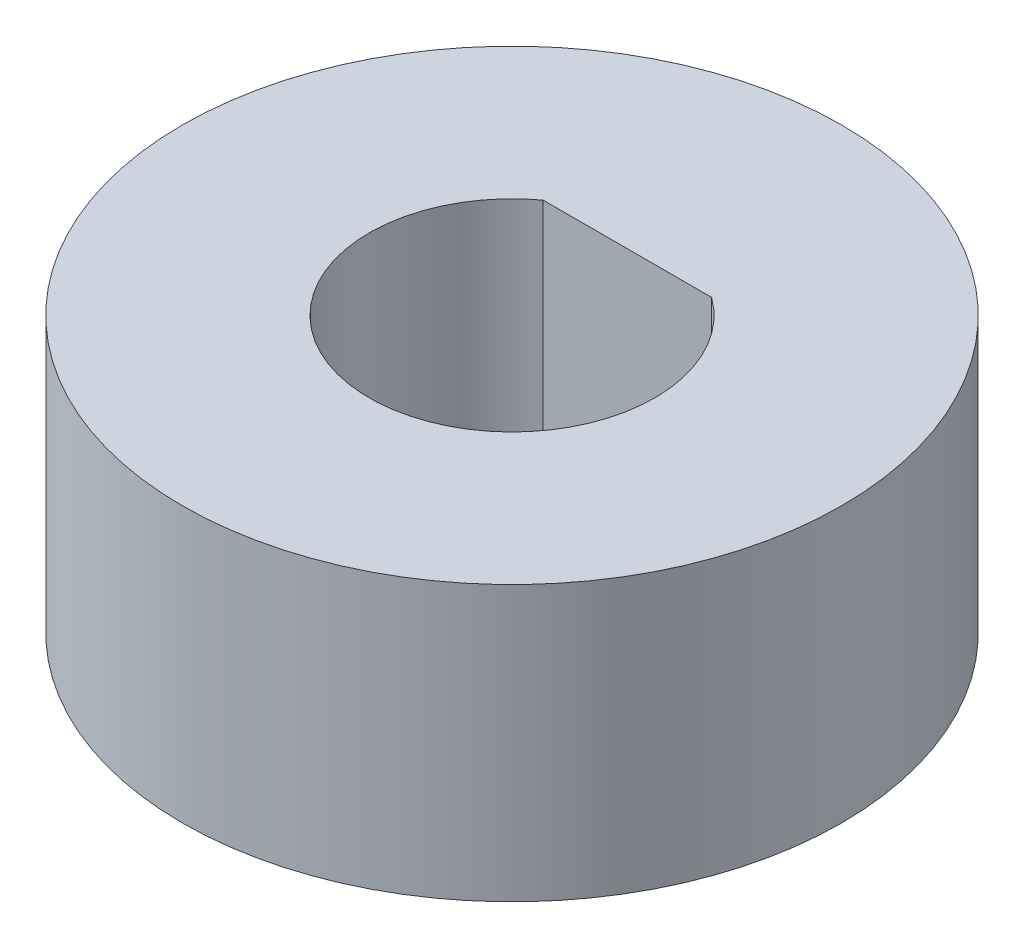
ISO-10303-21;
HEADER;
FILE_DESCRIPTION(('STEP AP214'),'2;1');
FILE_NAME('part.step','',(''),(''),'','','');
FILE_SCHEMA(('AUTOMOTIVE_DESIGN { 1 0 10303 214 1 1 1 1 }'));
ENDSEC;
DATA;
#1=APPLICATION_CONTEXT('core data for automotive mechanical design processes');
#2=APPLICATION_PROTOCOL_DEFINITION('international standard','automotive_design',2000,#1);
#3=PRODUCT_CONTEXT('',#1,'mechanical');
#4=PRODUCT('Part','Part','',(#3));
#5=PRODUCT_RELATED_PRODUCT_CATEGORY('part','',(#4));
#6=PRODUCT_DEFINITION_FORMATION('','',#4);
#7=PRODUCT_DEFINITION_CONTEXT('part definition',#1,'design');
#8=PRODUCT_DEFINITION('design','',#6,#7);
#9=PRODUCT_DEFINITION_SHAPE('','',#8);
#10=(LENGTH_UNIT() NAMED_UNIT(*) SI_UNIT(.MILLI.,.METRE.));
#11=(NAMED_UNIT(*) PLANE_ANGLE_UNIT() SI_UNIT($,.RADIAN.));
#12=(NAMED_UNIT(*) SI_UNIT($,.STERADIAN.) SOLID_ANGLE_UNIT());
#13=UNCERTAINTY_MEASURE_WITH_UNIT(LENGTH_MEASURE(1.E-05),#10,'distance_accuracy_value','');
#14=(GEOMETRIC_REPRESENTATION_CONTEXT(3) GLOBAL_UNCERTAINTY_ASSIGNED_CONTEXT((#13)) GLOBAL_UNIT_ASSIGNED_CONTEXT((#10,
#11,#12)) REPRESENTATION_CONTEXT('',''));
#15=CARTESIAN_POINT('',(0.,0.,0.));
#16=DIRECTION('',(0.,0.,1.));
#17=DIRECTION('',(1.,0.,0.));
#18=AXIS2_PLACEMENT_3D('',#15,#16,#17);
#19=CARTESIAN_POINT('',(0.,5.,0.));
#20=DIRECTION('',(0.,-1.,0.));
#21=DIRECTION('',(0.,0.,-1.));
#22=AXIS2_PLACEMENT_3D('',#19,#20,#21);
#23=CYLINDRICAL_SURFACE('',#22,6.);
#24=CARTESIAN_POINT('',(0.,5.,0.));
#25=DIRECTION('',(0.,1.,0.));
#26=DIRECTION('',(0.,0.,1.));
#27=AXIS2_PLACEMENT_3D('',#24,#25,#26);
#28=CIRCLE('',#27,6.);
#29=CARTESIAN_POINT('',(0.,5.,6.));
#30=VERTEX_POINT('',#29);
#31=EDGE_CURVE('E11',#30,#30,#28,.T.);
#32=ORIENTED_EDGE('',*,*,#31,.F.);
#33=EDGE_LOOP('',(#32));
#34=FACE_BOUND('',#33,.T.);
#35=CARTESIAN_POINT('',(0.,0.,0.));
#36=DIRECTION('',(0.,1.,0.));
#37=DIRECTION('',(0.,0.,1.));
#38=AXIS2_PLACEMENT_3D('',#35,#36,#37);
#39=CIRCLE('',#38,6.);
#40=CARTESIAN_POINT('',(0.,0.,6.));
#41=VERTEX_POINT('',#40);
#42=EDGE_CURVE('E38',#41,#41,#39,.T.);
#43=ORIENTED_EDGE('',*,*,#42,.T.);
#44=EDGE_LOOP('',(#43));
#45=FACE_BOUND('',#44,.T.);
#46=ADVANCED_FACE('F35',(#34,#45),#23,.T.);
#47=CARTESIAN_POINT('',(0.,5.,0.));
#48=DIRECTION('',(0.,1.,0.));
#49=DIRECTION('',(0.,0.,1.));
#50=AXIS2_PLACEMENT_3D('',#47,#48,#49);
#51=PLANE('',#50);
#52=CARTESIAN_POINT('',(0.,5.,0.));
#53=DIRECTION('',(0.,1.,0.));
#54=DIRECTION('',(0.,0.,1.));
#55=AXIS2_PLACEMENT_3D('',#52,#53,#54);
#56=CIRCLE('',#55,2.6);
#57=CARTESIAN_POINT('',(-1.53297097167559,5.,-2.1));
#58=VERTEX_POINT('',#57);
#59=CARTESIAN_POINT('',(1.53297097167559,5.,-2.1));
#60=VERTEX_POINT('',#59);
#61=EDGE_CURVE('E49',#58,#60,#56,.T.);
#62=ORIENTED_EDGE('',*,*,#61,.F.);
#63=DIRECTION('',(-1.,0.,0.));
#64=VECTOR('',#63,1.);
#65=CARTESIAN_POINT('',(1.53297097167559,5.,-2.1));
#66=LINE('',#65,#64);
#67=EDGE_CURVE('E68',#60,#58,#66,.T.);
#68=ORIENTED_EDGE('',*,*,#67,.F.);
#69=EDGE_LOOP('',(#62,#68));
#70=FACE_BOUND('',#69,.T.);
#71=ORIENTED_EDGE('',*,*,#31,.T.);
#72=EDGE_LOOP('',(#71));
#73=FACE_BOUND('',#72,.T.);
#74=ADVANCED_FACE('F72',(#70,#73),#51,.T.);
#75=CARTESIAN_POINT('',(0.,0.,0.));
#76=DIRECTION('',(0.,1.,0.));
#77=DIRECTION('',(0.,0.,1.));
#78=AXIS2_PLACEMENT_3D('',#75,#76,#77);
#79=PLANE('',#78);
#80=DIRECTION('',(-1.,0.,0.));
#81=VECTOR('',#80,1.);
#82=CARTESIAN_POINT('',(1.53297097167559,0.,-2.1));
#83=LINE('',#82,#81);
#84=CARTESIAN_POINT('',(1.53297097167559,0.,-2.1));
#85=VERTEX_POINT('',#84);
#86=CARTESIAN_POINT('',(-1.53297097167559,0.,-2.1));
#87=VERTEX_POINT('',#86);
#88=EDGE_CURVE('E76',#85,#87,#83,.T.);
#89=ORIENTED_EDGE('',*,*,#88,.T.);
#90=CARTESIAN_POINT('',(0.,0.,0.));
#91=DIRECTION('',(0.,1.,0.));
#92=DIRECTION('',(0.,0.,1.));
#93=AXIS2_PLACEMENT_3D('',#90,#91,#92);
#94=CIRCLE('',#93,2.6);
#95=EDGE_CURVE('E54',#87,#85,#94,.T.);
#96=ORIENTED_EDGE('',*,*,#95,.T.);
#97=EDGE_LOOP('',(#89,#96));
#98=FACE_BOUND('',#97,.T.);
#99=ORIENTED_EDGE('',*,*,#42,.F.);
#100=EDGE_LOOP('',(#99));
#101=FACE_BOUND('',#100,.T.);
#102=ADVANCED_FACE('F80',(#98,#101),#79,.F.);
#103=CARTESIAN_POINT('',(0.,0.,0.));
#104=DIRECTION('',(0.,1.,0.));
#105=DIRECTION('',(0.,0.,1.));
#106=AXIS2_PLACEMENT_3D('',#103,#104,#105);
#107=CYLINDRICAL_SURFACE('',#106,2.6);
#108=ORIENTED_EDGE('',*,*,#61,.T.);
#109=DIRECTION('',(0.,1.,0.));
#110=VECTOR('',#109,1.);
#111=CARTESIAN_POINT('',(1.53297097167559,0.,-2.1));
#112=LINE('',#111,#110);
#113=EDGE_CURVE('E65',#85,#60,#112,.T.);
#114=ORIENTED_EDGE('',*,*,#113,.F.);
#115=ORIENTED_EDGE('',*,*,#95,.F.);
#116=DIRECTION('',(0.,1.,0.));
#117=VECTOR('',#116,1.);
#118=CARTESIAN_POINT('',(-1.53297097167559,0.,-2.1));
#119=LINE('',#118,#117);
#120=EDGE_CURVE('E59',#87,#58,#119,.T.);
#121=ORIENTED_EDGE('',*,*,#120,.T.);
#122=EDGE_LOOP('',(#108,#114,#115,#121));
#123=FACE_BOUND('',#122,.T.);
#124=ADVANCED_FACE('F61',(#123),#107,.F.);
#125=CARTESIAN_POINT('',(1.53297097167559,0.,-2.1));
#126=DIRECTION('',(0.,0.,-1.));
#127=DIRECTION('',(-1.,0.,0.));
#128=AXIS2_PLACEMENT_3D('',#125,#126,#127);
#129=PLANE('',#128);
#130=ORIENTED_EDGE('',*,*,#67,.T.);
#131=ORIENTED_EDGE('',*,*,#120,.F.);
#132=ORIENTED_EDGE('',*,*,#88,.F.);
#133=ORIENTED_EDGE('',*,*,#113,.T.);
#134=EDGE_LOOP('',(#130,#131,#132,#133));
#135=FACE_BOUND('',#134,.T.);
#136=ADVANCED_FACE('F69',(#135),#129,.F.);
#137=CLOSED_SHELL('',(#46,#74,#102,#124,#136));
#138=MANIFOLD_SOLID_BREP('B2',#137);
#139=ADVANCED_BREP_SHAPE_REPRESENTATION('',(#18,#138),#14);
#140=SHAPE_DEFINITION_REPRESENTATION(#9,#139);
ENDSEC;
END-ISO-10303-21;
